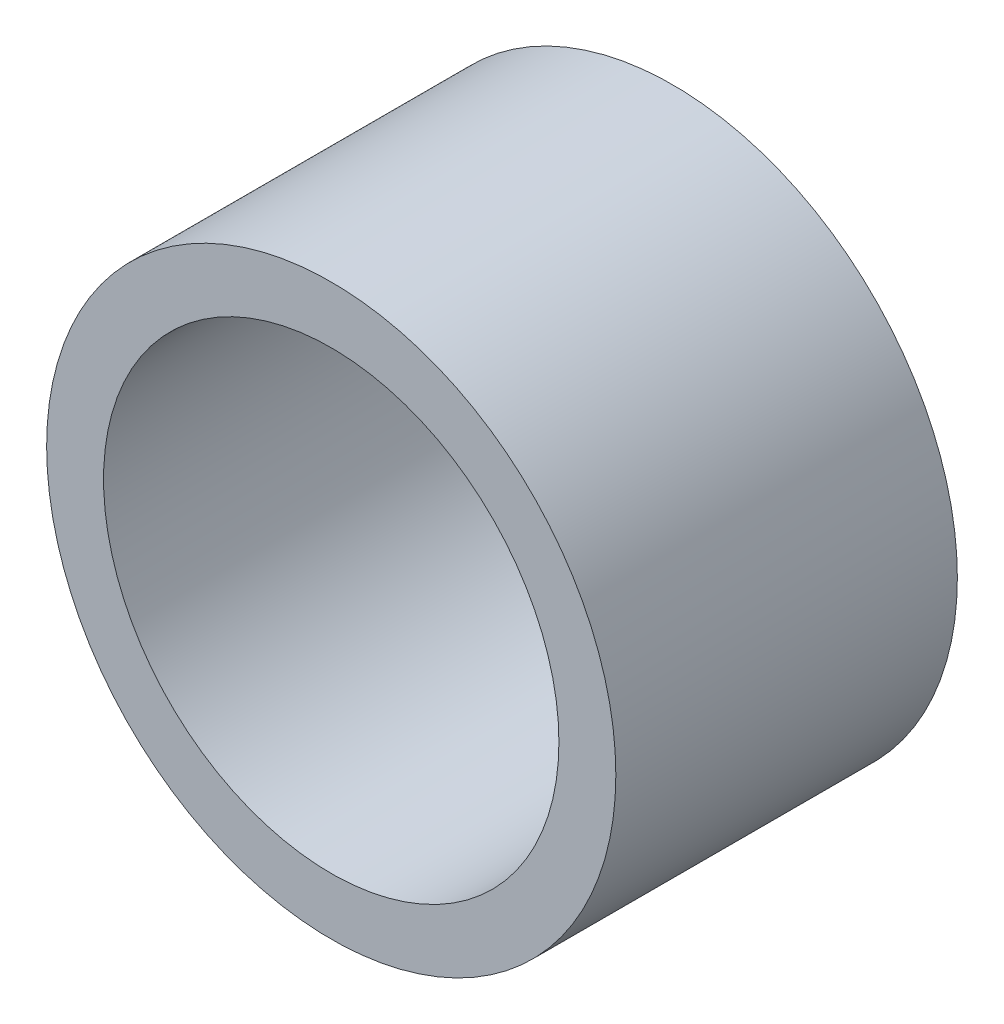
ISO-10303-21;
HEADER;
FILE_DESCRIPTION(('STEP AP214'),'2;1');
FILE_NAME('part.step','',(''),(''),'','','');
FILE_SCHEMA(('AUTOMOTIVE_DESIGN { 1 0 10303 214 1 1 1 1 }'));
ENDSEC;
DATA;
#1=APPLICATION_CONTEXT('core data for automotive mechanical design processes');
#2=APPLICATION_PROTOCOL_DEFINITION('international standard','automotive_design',2000,#1);
#3=PRODUCT_CONTEXT('',#1,'mechanical');
#4=PRODUCT('Part','Part','',(#3));
#5=PRODUCT_RELATED_PRODUCT_CATEGORY('part','',(#4));
#6=PRODUCT_DEFINITION_FORMATION('','',#4);
#7=PRODUCT_DEFINITION_CONTEXT('part definition',#1,'design');
#8=PRODUCT_DEFINITION('design','',#6,#7);
#9=PRODUCT_DEFINITION_SHAPE('','',#8);
#10=(LENGTH_UNIT() NAMED_UNIT(*) SI_UNIT(.MILLI.,.METRE.));
#11=(NAMED_UNIT(*) PLANE_ANGLE_UNIT() SI_UNIT($,.RADIAN.));
#12=(NAMED_UNIT(*) SI_UNIT($,.STERADIAN.) SOLID_ANGLE_UNIT());
#13=UNCERTAINTY_MEASURE_WITH_UNIT(LENGTH_MEASURE(1.E-05),#10,'distance_accuracy_value','');
#14=(GEOMETRIC_REPRESENTATION_CONTEXT(3) GLOBAL_UNCERTAINTY_ASSIGNED_CONTEXT((#13)) GLOBAL_UNIT_ASSIGNED_CONTEXT((#10,
#11,#12)) REPRESENTATION_CONTEXT('',''));
#15=CARTESIAN_POINT('',(0.,0.,0.));
#16=DIRECTION('',(0.,0.,1.));
#17=DIRECTION('',(1.,0.,0.));
#18=AXIS2_PLACEMENT_3D('',#15,#16,#17);
#19=CARTESIAN_POINT('',(0.,0.,12.));
#20=DIRECTION('',(0.,0.,1.));
#21=DIRECTION('',(1.,0.,0.));
#22=AXIS2_PLACEMENT_3D('',#19,#20,#21);
#23=PLANE('',#22);
#24=CARTESIAN_POINT('',(0.,0.,12.));
#25=DIRECTION('',(0.,0.,1.));
#26=DIRECTION('',(1.,0.,0.));
#27=AXIS2_PLACEMENT_3D('',#24,#25,#26);
#28=CIRCLE('',#27,10.);
#29=CARTESIAN_POINT('',(10.,0.,12.));
#30=VERTEX_POINT('',#29);
#31=EDGE_CURVE('E12',#30,#30,#28,.T.);
#32=ORIENTED_EDGE('',*,*,#31,.T.);
#33=EDGE_LOOP('',(#32));
#34=FACE_BOUND('',#33,.T.);
#35=CARTESIAN_POINT('',(0.,0.,12.));
#36=DIRECTION('',(0.,0.,1.));
#37=DIRECTION('',(1.,0.,0.));
#38=AXIS2_PLACEMENT_3D('',#35,#36,#37);
#39=CIRCLE('',#38,8.);
#40=CARTESIAN_POINT('',(8.,0.,12.));
#41=VERTEX_POINT('',#40);
#42=EDGE_CURVE('E53',#41,#41,#39,.T.);
#43=ORIENTED_EDGE('',*,*,#42,.F.);
#44=EDGE_LOOP('',(#43));
#45=FACE_BOUND('',#44,.T.);
#46=ADVANCED_FACE('F42',(#34,#45),#23,.T.);
#47=CARTESIAN_POINT('',(0.,0.,0.));
#48=DIRECTION('',(0.,0.,1.));
#49=DIRECTION('',(1.,0.,0.));
#50=AXIS2_PLACEMENT_3D('',#47,#48,#49);
#51=PLANE('',#50);
#52=CARTESIAN_POINT('',(0.,0.,0.));
#53=DIRECTION('',(0.,0.,1.));
#54=DIRECTION('',(1.,0.,0.));
#55=AXIS2_PLACEMENT_3D('',#52,#53,#54);
#56=CIRCLE('',#55,10.);
#57=CARTESIAN_POINT('',(10.,0.,0.));
#58=VERTEX_POINT('',#57);
#59=EDGE_CURVE('E46',#58,#58,#56,.T.);
#60=ORIENTED_EDGE('',*,*,#59,.F.);
#61=EDGE_LOOP('',(#60));
#62=FACE_BOUND('',#61,.T.);
#63=CARTESIAN_POINT('',(0.,0.,0.));
#64=DIRECTION('',(0.,0.,1.));
#65=DIRECTION('',(1.,0.,0.));
#66=AXIS2_PLACEMENT_3D('',#63,#64,#65);
#67=CIRCLE('',#66,8.);
#68=CARTESIAN_POINT('',(8.,0.,0.));
#69=VERTEX_POINT('',#68);
#70=EDGE_CURVE('E55',#69,#69,#67,.T.);
#71=ORIENTED_EDGE('',*,*,#70,.T.);
#72=EDGE_LOOP('',(#71));
#73=FACE_BOUND('',#72,.T.);
#74=ADVANCED_FACE('F65',(#62,#73),#51,.F.);
#75=CARTESIAN_POINT('',(0.,0.,12.));
#76=DIRECTION('',(0.,0.,-1.));
#77=DIRECTION('',(-1.,0.,0.));
#78=AXIS2_PLACEMENT_3D('',#75,#76,#77);
#79=CYLINDRICAL_SURFACE('',#78,10.);
#80=ORIENTED_EDGE('',*,*,#31,.F.);
#81=EDGE_LOOP('',(#80));
#82=FACE_BOUND('',#81,.T.);
#83=ORIENTED_EDGE('',*,*,#59,.T.);
#84=EDGE_LOOP('',(#83));
#85=FACE_BOUND('',#84,.T.);
#86=ADVANCED_FACE('F44',(#82,#85),#79,.T.);
#87=CARTESIAN_POINT('',(0.,0.,12.));
#88=DIRECTION('',(0.,0.,-1.));
#89=DIRECTION('',(-1.,0.,0.));
#90=AXIS2_PLACEMENT_3D('',#87,#88,#89);
#91=CYLINDRICAL_SURFACE('',#90,8.);
#92=ORIENTED_EDGE('',*,*,#42,.T.);
#93=EDGE_LOOP('',(#92));
#94=FACE_BOUND('',#93,.T.);
#95=ORIENTED_EDGE('',*,*,#70,.F.);
#96=EDGE_LOOP('',(#95));
#97=FACE_BOUND('',#96,.T.);
#98=ADVANCED_FACE('F61',(#94,#97),#91,.F.);
#99=CLOSED_SHELL('',(#46,#74,#86,#98));
#100=MANIFOLD_SOLID_BREP('B2',#99);
#101=ADVANCED_BREP_SHAPE_REPRESENTATION('',(#18,#100),#14);
#102=SHAPE_DEFINITION_REPRESENTATION(#9,#101);
ENDSEC;
END-ISO-10303-21;
